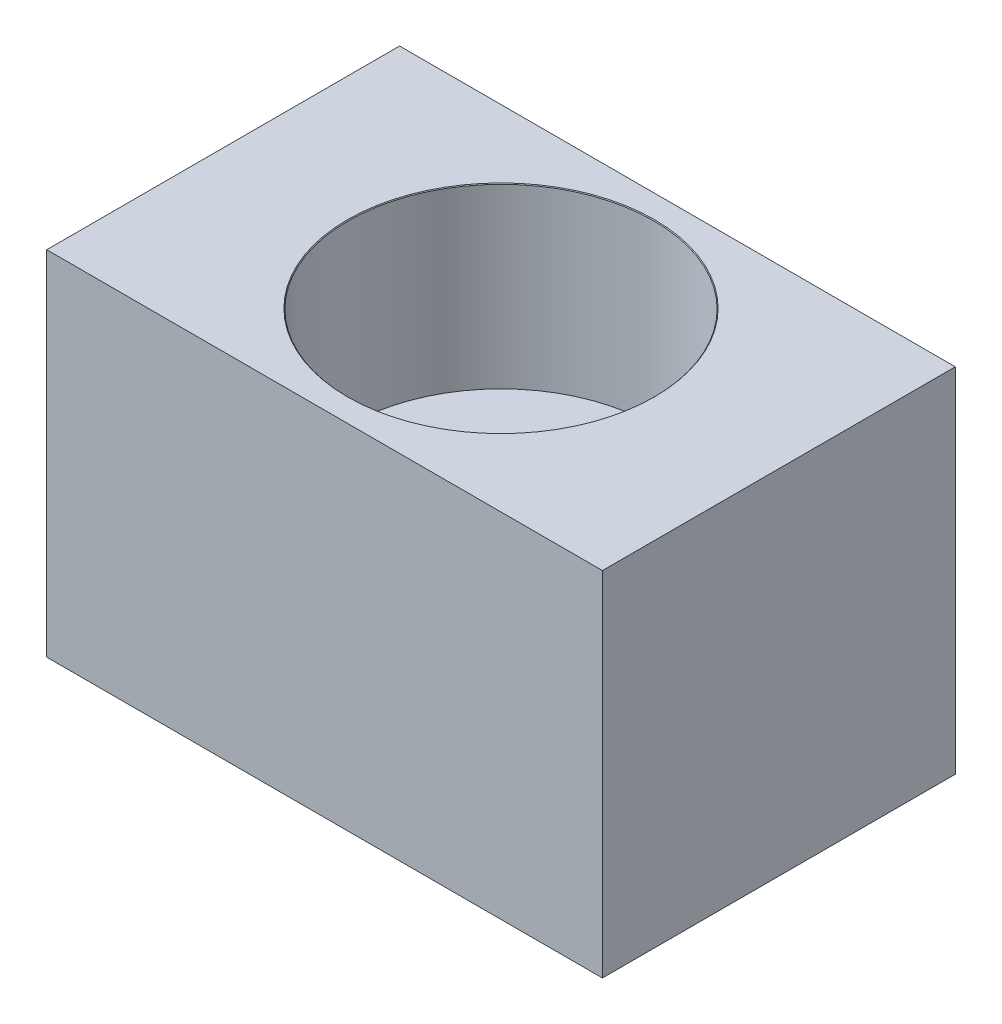
ISO-10303-21;
HEADER;
FILE_DESCRIPTION(('STEP AP214'),'2;1');
FILE_NAME('part.step','',(''),(''),'','','');
FILE_SCHEMA(('AUTOMOTIVE_DESIGN { 1 0 10303 214 1 1 1 1 }'));
ENDSEC;
DATA;
#1=APPLICATION_CONTEXT('core data for automotive mechanical design processes');
#2=APPLICATION_PROTOCOL_DEFINITION('international standard','automotive_design',2000,#1);
#3=PRODUCT_CONTEXT('',#1,'mechanical');
#4=PRODUCT('Part','Part','',(#3));
#5=PRODUCT_RELATED_PRODUCT_CATEGORY('part','',(#4));
#6=PRODUCT_DEFINITION_FORMATION('','',#4);
#7=PRODUCT_DEFINITION_CONTEXT('part definition',#1,'design');
#8=PRODUCT_DEFINITION('design','',#6,#7);
#9=PRODUCT_DEFINITION_SHAPE('','',#8);
#10=(LENGTH_UNIT() NAMED_UNIT(*) SI_UNIT(.MILLI.,.METRE.));
#11=(NAMED_UNIT(*) PLANE_ANGLE_UNIT() SI_UNIT($,.RADIAN.));
#12=(NAMED_UNIT(*) SI_UNIT($,.STERADIAN.) SOLID_ANGLE_UNIT());
#13=UNCERTAINTY_MEASURE_WITH_UNIT(LENGTH_MEASURE(1.E-05),#10,'distance_accuracy_value','');
#14=(GEOMETRIC_REPRESENTATION_CONTEXT(3) GLOBAL_UNCERTAINTY_ASSIGNED_CONTEXT((#13)) GLOBAL_UNIT_ASSIGNED_CONTEXT((#10,
#11,#12)) REPRESENTATION_CONTEXT('',''));
#15=CARTESIAN_POINT('',(0.,0.,0.));
#16=DIRECTION('',(0.,0.,1.));
#17=DIRECTION('',(1.,0.,0.));
#18=AXIS2_PLACEMENT_3D('',#15,#16,#17);
#19=CARTESIAN_POINT('',(-10.,6.35,6.35));
#20=DIRECTION('',(1.,0.,0.));
#21=DIRECTION('',(0.,0.,-1.));
#22=AXIS2_PLACEMENT_3D('',#19,#20,#21);
#23=PLANE('',#22);
#24=DIRECTION('',(0.,-1.,0.));
#25=VECTOR('',#24,1.);
#26=CARTESIAN_POINT('',(-10.,6.35,-6.35));
#27=LINE('',#26,#25);
#28=CARTESIAN_POINT('',(-10.,6.35,-6.35));
#29=VERTEX_POINT('',#28);
#30=CARTESIAN_POINT('',(-10.,-6.35,-6.35));
#31=VERTEX_POINT('',#30);
#32=EDGE_CURVE('E96',#29,#31,#27,.T.);
#33=ORIENTED_EDGE('',*,*,#32,.T.);
#34=DIRECTION('',(0.,0.,-1.));
#35=VECTOR('',#34,1.);
#36=CARTESIAN_POINT('',(-10.,-6.35,6.35));
#37=LINE('',#36,#35);
#38=CARTESIAN_POINT('',(-10.,-6.35,6.35));
#39=VERTEX_POINT('',#38);
#40=EDGE_CURVE('E11',#39,#31,#37,.T.);
#41=ORIENTED_EDGE('',*,*,#40,.F.);
#42=DIRECTION('',(0.,-1.,0.));
#43=VECTOR('',#42,1.);
#44=CARTESIAN_POINT('',(-10.,6.35,6.35));
#45=LINE('',#44,#43);
#46=CARTESIAN_POINT('',(-10.,6.35,6.35));
#47=VERTEX_POINT('',#46);
#48=EDGE_CURVE('E84',#47,#39,#45,.T.);
#49=ORIENTED_EDGE('',*,*,#48,.F.);
#50=DIRECTION('',(0.,0.,-1.));
#51=VECTOR('',#50,1.);
#52=CARTESIAN_POINT('',(-10.,6.35,6.35));
#53=LINE('',#52,#51);
#54=EDGE_CURVE('E92',#47,#29,#53,.T.);
#55=ORIENTED_EDGE('',*,*,#54,.T.);
#56=EDGE_LOOP('',(#33,#41,#49,#55));
#57=FACE_BOUND('',#56,.T.);
#58=ADVANCED_FACE('F33',(#57),#23,.F.);
#59=CARTESIAN_POINT('',(10.,-6.35,6.35));
#60=DIRECTION('',(0.,1.,0.));
#61=DIRECTION('',(-1.,0.,0.));
#62=AXIS2_PLACEMENT_3D('',#59,#60,#61);
#63=PLANE('',#62);
#64=CARTESIAN_POINT('',(0.,-6.35,0.));
#65=DIRECTION('',(0.,1.,0.));
#66=DIRECTION('',(0.,0.,1.));
#67=AXIS2_PLACEMENT_3D('',#64,#65,#66);
#68=CIRCLE('',#67,3.325);
#69=CARTESIAN_POINT('',(0.,-6.35,3.325));
#70=VERTEX_POINT('',#69);
#71=EDGE_CURVE('E124',#70,#70,#68,.T.);
#72=ORIENTED_EDGE('',*,*,#71,.T.);
#73=EDGE_LOOP('',(#72));
#74=FACE_BOUND('',#73,.T.);
#75=DIRECTION('',(1.,0.,0.));
#76=VECTOR('',#75,1.);
#77=CARTESIAN_POINT('',(10.,-6.35,-6.35));
#78=LINE('',#77,#76);
#79=CARTESIAN_POINT('',(10.,-6.35,-6.35));
#80=VERTEX_POINT('',#79);
#81=EDGE_CURVE('E88',#31,#80,#78,.T.);
#82=ORIENTED_EDGE('',*,*,#81,.T.);
#83=DIRECTION('',(0.,0.,-1.));
#84=VECTOR('',#83,1.);
#85=CARTESIAN_POINT('',(10.,-6.35,6.35));
#86=LINE('',#85,#84);
#87=CARTESIAN_POINT('',(10.,-6.35,6.35));
#88=VERTEX_POINT('',#87);
#89=EDGE_CURVE('E41',#88,#80,#86,.T.);
#90=ORIENTED_EDGE('',*,*,#89,.F.);
#91=DIRECTION('',(1.,0.,0.));
#92=VECTOR('',#91,1.);
#93=CARTESIAN_POINT('',(10.,-6.35,6.35));
#94=LINE('',#93,#92);
#95=EDGE_CURVE('E79',#39,#88,#94,.T.);
#96=ORIENTED_EDGE('',*,*,#95,.F.);
#97=ORIENTED_EDGE('',*,*,#40,.T.);
#98=EDGE_LOOP('',(#82,#90,#96,#97));
#99=FACE_BOUND('',#98,.T.);
#100=ADVANCED_FACE('F87',(#74,#99),#63,.F.);
#101=CARTESIAN_POINT('',(10.,6.35,6.35));
#102=DIRECTION('',(-1.,0.,0.));
#103=DIRECTION('',(0.,0.,1.));
#104=AXIS2_PLACEMENT_3D('',#101,#102,#103);
#105=PLANE('',#104);
#106=DIRECTION('',(0.,1.,0.));
#107=VECTOR('',#106,1.);
#108=CARTESIAN_POINT('',(10.,6.35,-6.35));
#109=LINE('',#108,#107);
#110=CARTESIAN_POINT('',(10.,6.35,-6.35));
#111=VERTEX_POINT('',#110);
#112=EDGE_CURVE('E66',#80,#111,#109,.T.);
#113=ORIENTED_EDGE('',*,*,#112,.T.);
#114=DIRECTION('',(0.,0.,-1.));
#115=VECTOR('',#114,1.);
#116=CARTESIAN_POINT('',(10.,6.35,6.35));
#117=LINE('',#116,#115);
#118=CARTESIAN_POINT('',(10.,6.35,6.35));
#119=VERTEX_POINT('',#118);
#120=EDGE_CURVE('E89',#119,#111,#117,.T.);
#121=ORIENTED_EDGE('',*,*,#120,.F.);
#122=DIRECTION('',(0.,1.,0.));
#123=VECTOR('',#122,1.);
#124=CARTESIAN_POINT('',(10.,6.35,6.35));
#125=LINE('',#124,#123);
#126=EDGE_CURVE('E82',#88,#119,#125,.T.);
#127=ORIENTED_EDGE('',*,*,#126,.F.);
#128=ORIENTED_EDGE('',*,*,#89,.T.);
#129=EDGE_LOOP('',(#113,#121,#127,#128));
#130=FACE_BOUND('',#129,.T.);
#131=ADVANCED_FACE('F90',(#130),#105,.F.);
#132=CARTESIAN_POINT('',(10.,6.35,6.35));
#133=DIRECTION('',(0.,-1.,0.));
#134=DIRECTION('',(1.,0.,0.));
#135=AXIS2_PLACEMENT_3D('',#132,#133,#134);
#136=PLANE('',#135);
#137=CARTESIAN_POINT('',(0.,6.35,0.));
#138=DIRECTION('',(0.,1.,0.));
#139=DIRECTION('',(0.,0.,1.));
#140=AXIS2_PLACEMENT_3D('',#137,#138,#139);
#141=CIRCLE('',#140,5.525);
#142=CARTESIAN_POINT('',(0.,6.35,5.525));
#143=VERTEX_POINT('',#142);
#144=EDGE_CURVE('E121',#143,#143,#141,.T.);
#145=ORIENTED_EDGE('',*,*,#144,.F.);
#146=EDGE_LOOP('',(#145));
#147=FACE_BOUND('',#146,.T.);
#148=DIRECTION('',(-1.,0.,0.));
#149=VECTOR('',#148,1.);
#150=CARTESIAN_POINT('',(10.,6.35,-6.35));
#151=LINE('',#150,#149);
#152=EDGE_CURVE('E72',#111,#29,#151,.T.);
#153=ORIENTED_EDGE('',*,*,#152,.T.);
#154=ORIENTED_EDGE('',*,*,#54,.F.);
#155=DIRECTION('',(-1.,0.,0.));
#156=VECTOR('',#155,1.);
#157=CARTESIAN_POINT('',(10.,6.35,6.35));
#158=LINE('',#157,#156);
#159=EDGE_CURVE('E49',#119,#47,#158,.T.);
#160=ORIENTED_EDGE('',*,*,#159,.F.);
#161=ORIENTED_EDGE('',*,*,#120,.T.);
#162=EDGE_LOOP('',(#153,#154,#160,#161));
#163=FACE_BOUND('',#162,.T.);
#164=ADVANCED_FACE('F104',(#147,#163),#136,.F.);
#165=CARTESIAN_POINT('',(0.,0.,6.35));
#166=DIRECTION('',(0.,0.,-1.));
#167=DIRECTION('',(-1.,0.,0.));
#168=AXIS2_PLACEMENT_3D('',#165,#166,#167);
#169=PLANE('',#168);
#170=ORIENTED_EDGE('',*,*,#48,.T.);
#171=ORIENTED_EDGE('',*,*,#95,.T.);
#172=ORIENTED_EDGE('',*,*,#126,.T.);
#173=ORIENTED_EDGE('',*,*,#159,.T.);
#174=EDGE_LOOP('',(#170,#171,#172,#173));
#175=FACE_BOUND('',#174,.T.);
#176=ADVANCED_FACE('F80',(#175),#169,.F.);
#177=CARTESIAN_POINT('',(0.,0.,-6.35));
#178=DIRECTION('',(0.,0.,-1.));
#179=DIRECTION('',(-1.,0.,0.));
#180=AXIS2_PLACEMENT_3D('',#177,#178,#179);
#181=PLANE('',#180);
#182=ORIENTED_EDGE('',*,*,#32,.F.);
#183=ORIENTED_EDGE('',*,*,#152,.F.);
#184=ORIENTED_EDGE('',*,*,#112,.F.);
#185=ORIENTED_EDGE('',*,*,#81,.F.);
#186=EDGE_LOOP('',(#182,#183,#184,#185));
#187=FACE_BOUND('',#186,.T.);
#188=ADVANCED_FACE('F107',(#187),#181,.T.);
#189=CARTESIAN_POINT('',(0.,-6.325,0.));
#190=DIRECTION('',(0.,-1.,0.));
#191=DIRECTION('',(0.,0.,-1.));
#192=AXIS2_PLACEMENT_3D('',#189,#190,#191);
#193=CONICAL_SURFACE('',#192,3.3,0.78539816339744);
#194=ORIENTED_EDGE('',*,*,#71,.F.);
#195=EDGE_LOOP('',(#194));
#196=FACE_BOUND('',#195,.T.);
#197=CARTESIAN_POINT('',(0.,-6.325,0.));
#198=DIRECTION('',(0.,1.,0.));
#199=DIRECTION('',(0.,0.,1.));
#200=AXIS2_PLACEMENT_3D('',#197,#198,#199);
#201=CIRCLE('',#200,3.3);
#202=CARTESIAN_POINT('',(0.,-6.325,3.3));
#203=VERTEX_POINT('',#202);
#204=EDGE_CURVE('E99',#203,#203,#201,.T.);
#205=ORIENTED_EDGE('',*,*,#204,.T.);
#206=EDGE_LOOP('',(#205));
#207=FACE_BOUND('',#206,.T.);
#208=ADVANCED_FACE('F129',(#196,#207),#193,.F.);
#209=CARTESIAN_POINT('',(0.,6.35,0.));
#210=DIRECTION('',(0.,1.,0.));
#211=DIRECTION('',(0.,0.,1.));
#212=AXIS2_PLACEMENT_3D('',#209,#210,#211);
#213=CYLINDRICAL_SURFACE('',#212,3.3);
#214=ORIENTED_EDGE('',*,*,#204,.F.);
#215=EDGE_LOOP('',(#214));
#216=FACE_BOUND('',#215,.T.);
#217=CARTESIAN_POINT('',(0.,-0.0499999999999997,0.));
#218=DIRECTION('',(0.,1.,0.));
#219=DIRECTION('',(0.,0.,1.));
#220=AXIS2_PLACEMENT_3D('',#217,#218,#219);
#221=CIRCLE('',#220,3.3);
#222=CARTESIAN_POINT('',(0.,-0.0499999999999997,3.3));
#223=VERTEX_POINT('',#222);
#224=EDGE_CURVE('E112',#223,#223,#221,.T.);
#225=ORIENTED_EDGE('',*,*,#224,.T.);
#226=EDGE_LOOP('',(#225));
#227=FACE_BOUND('',#226,.T.);
#228=ADVANCED_FACE('F132',(#216,#227),#213,.F.);
#229=CARTESIAN_POINT('',(5.5,-0.0499999999999997,0.));
#230=DIRECTION('',(0.,-1.,0.));
#231=DIRECTION('',(0.,0.,-1.));
#232=AXIS2_PLACEMENT_3D('',#229,#230,#231);
#233=PLANE('',#232);
#234=ORIENTED_EDGE('',*,*,#224,.F.);
#235=EDGE_LOOP('',(#234));
#236=FACE_BOUND('',#235,.T.);
#237=CARTESIAN_POINT('',(0.,-0.0499999999999997,0.));
#238=DIRECTION('',(0.,1.,0.));
#239=DIRECTION('',(0.,0.,1.));
#240=AXIS2_PLACEMENT_3D('',#237,#238,#239);
#241=CIRCLE('',#240,5.5);
#242=CARTESIAN_POINT('',(0.,-0.0499999999999997,5.5));
#243=VERTEX_POINT('',#242);
#244=EDGE_CURVE('E115',#243,#243,#241,.T.);
#245=ORIENTED_EDGE('',*,*,#244,.T.);
#246=EDGE_LOOP('',(#245));
#247=FACE_BOUND('',#246,.T.);
#248=ADVANCED_FACE('F138',(#236,#247),#233,.F.);
#249=CARTESIAN_POINT('',(0.,6.35,0.));
#250=DIRECTION('',(0.,1.,0.));
#251=DIRECTION('',(0.,0.,1.));
#252=AXIS2_PLACEMENT_3D('',#249,#250,#251);
#253=CYLINDRICAL_SURFACE('',#252,5.5);
#254=ORIENTED_EDGE('',*,*,#244,.F.);
#255=EDGE_LOOP('',(#254));
#256=FACE_BOUND('',#255,.T.);
#257=CARTESIAN_POINT('',(0.,6.325,0.));
#258=DIRECTION('',(0.,1.,0.));
#259=DIRECTION('',(0.,0.,1.));
#260=AXIS2_PLACEMENT_3D('',#257,#258,#259);
#261=CIRCLE('',#260,5.5);
#262=CARTESIAN_POINT('',(0.,6.325,5.5));
#263=VERTEX_POINT('',#262);
#264=EDGE_CURVE('E118',#263,#263,#261,.T.);
#265=ORIENTED_EDGE('',*,*,#264,.T.);
#266=EDGE_LOOP('',(#265));
#267=FACE_BOUND('',#266,.T.);
#268=ADVANCED_FACE('F144',(#256,#267),#253,.F.);
#269=CARTESIAN_POINT('',(0.,6.35,0.));
#270=DIRECTION('',(0.,1.,0.));
#271=DIRECTION('',(0.,0.,1.));
#272=AXIS2_PLACEMENT_3D('',#269,#270,#271);
#273=CONICAL_SURFACE('',#272,5.525,0.785398163397431);
#274=ORIENTED_EDGE('',*,*,#264,.F.);
#275=EDGE_LOOP('',(#274));
#276=FACE_BOUND('',#275,.T.);
#277=ORIENTED_EDGE('',*,*,#144,.T.);
#278=EDGE_LOOP('',(#277));
#279=FACE_BOUND('',#278,.T.);
#280=ADVANCED_FACE('F150',(#276,#279),#273,.F.);
#281=CLOSED_SHELL('',(#58,#100,#131,#164,#176,#188,#208,#228,#248,#268,#280));
#282=MANIFOLD_SOLID_BREP('B2',#281);
#283=ADVANCED_BREP_SHAPE_REPRESENTATION('',(#18,#282),#14);
#284=SHAPE_DEFINITION_REPRESENTATION(#9,#283);
ENDSEC;
END-ISO-10303-21;
